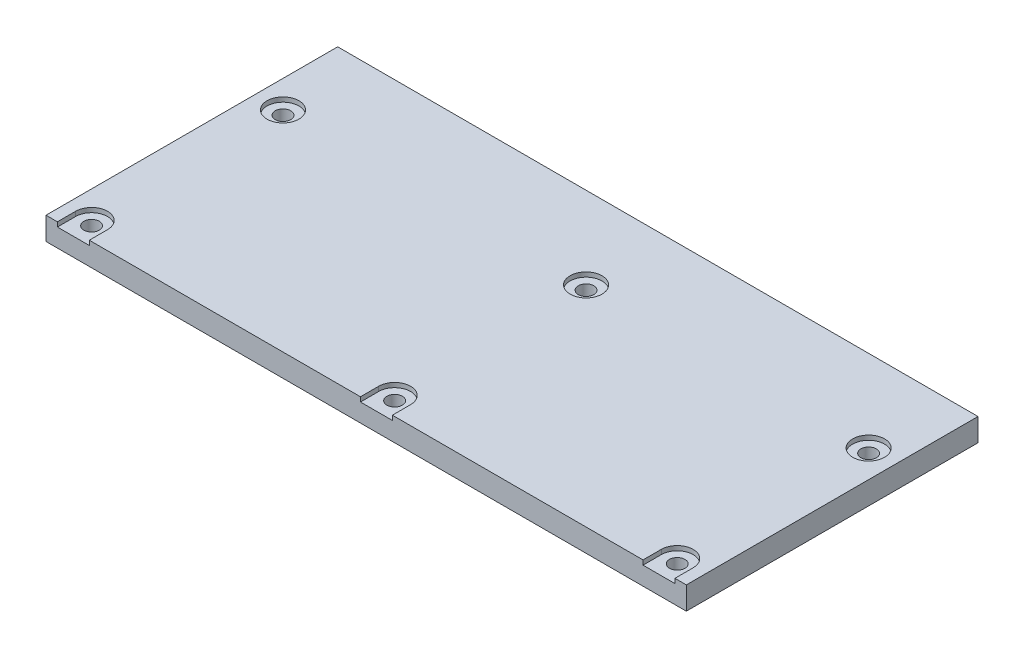
ISO-10303-21;
HEADER;
FILE_DESCRIPTION(('STEP AP214'),'2;1');
FILE_NAME('part.step','',(''),(''),'','','');
FILE_SCHEMA(('AUTOMOTIVE_DESIGN { 1 0 10303 214 1 1 1 1 }'));
ENDSEC;
DATA;
#1=APPLICATION_CONTEXT('core data for automotive mechanical design processes');
#2=APPLICATION_PROTOCOL_DEFINITION('international standard','automotive_design',2000,#1);
#3=PRODUCT_CONTEXT('',#1,'mechanical');
#4=PRODUCT('Part','Part','',(#3));
#5=PRODUCT_RELATED_PRODUCT_CATEGORY('part','',(#4));
#6=PRODUCT_DEFINITION_FORMATION('','',#4);
#7=PRODUCT_DEFINITION_CONTEXT('part definition',#1,'design');
#8=PRODUCT_DEFINITION('design','',#6,#7);
#9=PRODUCT_DEFINITION_SHAPE('','',#8);
#10=(LENGTH_UNIT() NAMED_UNIT(*) SI_UNIT(.MILLI.,.METRE.));
#11=(NAMED_UNIT(*) PLANE_ANGLE_UNIT() SI_UNIT($,.RADIAN.));
#12=(NAMED_UNIT(*) SI_UNIT($,.STERADIAN.) SOLID_ANGLE_UNIT());
#13=UNCERTAINTY_MEASURE_WITH_UNIT(LENGTH_MEASURE(1.E-05),#10,'distance_accuracy_value','');
#14=(GEOMETRIC_REPRESENTATION_CONTEXT(3) GLOBAL_UNCERTAINTY_ASSIGNED_CONTEXT((#13)) GLOBAL_UNIT_ASSIGNED_CONTEXT((#10,
#11,#12)) REPRESENTATION_CONTEXT('',''));
#15=CARTESIAN_POINT('',(0.,0.,0.));
#16=DIRECTION('',(0.,0.,1.));
#17=DIRECTION('',(1.,0.,0.));
#18=AXIS2_PLACEMENT_3D('',#15,#16,#17);
#19=CARTESIAN_POINT('',(-87.2486187845304,5.,-43.8729281767956));
#20=DIRECTION('',(1.,0.,0.));
#21=DIRECTION('',(0.,0.,-1.));
#22=AXIS2_PLACEMENT_3D('',#19,#20,#21);
#23=PLANE('',#22);
#24=DIRECTION('',(0.,0.,1.));
#25=VECTOR('',#24,1.);
#26=CARTESIAN_POINT('',(-87.2486187845304,0.,-43.8729281767956));
#27=LINE('',#26,#25);
#28=CARTESIAN_POINT('',(-87.2486187845304,0.,-43.8729281767956));
#29=VERTEX_POINT('',#28);
#30=CARTESIAN_POINT('',(-87.2486187845304,0.,20.1270718232044));
#31=VERTEX_POINT('',#30);
#32=EDGE_CURVE('E296',#29,#31,#27,.T.);
#33=ORIENTED_EDGE('',*,*,#32,.T.);
#34=DIRECTION('',(0.,-1.,0.));
#35=VECTOR('',#34,1.);
#36=CARTESIAN_POINT('',(-87.2486187845304,5.,20.1270718232044));
#37=LINE('',#36,#35);
#38=CARTESIAN_POINT('',(-87.2486187845304,5.,20.1270718232044));
#39=VERTEX_POINT('',#38);
#40=EDGE_CURVE('E11',#39,#31,#37,.T.);
#41=ORIENTED_EDGE('',*,*,#40,.F.);
#42=DIRECTION('',(0.,0.,1.));
#43=VECTOR('',#42,1.);
#44=CARTESIAN_POINT('',(-87.2486187845304,5.,-43.8729281767956));
#45=LINE('',#44,#43);
#46=CARTESIAN_POINT('',(-87.2486187845304,5.,-43.8729281767956));
#47=VERTEX_POINT('',#46);
#48=EDGE_CURVE('E297',#47,#39,#45,.T.);
#49=ORIENTED_EDGE('',*,*,#48,.F.);
#50=DIRECTION('',(0.,-1.,0.));
#51=VECTOR('',#50,1.);
#52=CARTESIAN_POINT('',(-87.2486187845304,5.,-43.8729281767956));
#53=LINE('',#52,#51);
#54=EDGE_CURVE('E309',#47,#29,#53,.T.);
#55=ORIENTED_EDGE('',*,*,#54,.T.);
#56=EDGE_LOOP('',(#33,#41,#49,#55));
#57=FACE_BOUND('',#56,.T.);
#58=ADVANCED_FACE('F40',(#57),#23,.F.);
#59=CARTESIAN_POINT('',(-87.2486187845304,5.,20.1270718232044));
#60=DIRECTION('',(0.,0.,-1.));
#61=DIRECTION('',(-1.,0.,0.));
#62=AXIS2_PLACEMENT_3D('',#59,#60,#61);
#63=PLANE('',#62);
#64=DIRECTION('',(1.,0.,0.));
#65=VECTOR('',#64,1.);
#66=CARTESIAN_POINT('',(-87.2486187845304,5.,20.1270718232044));
#67=LINE('',#66,#65);
#68=CARTESIAN_POINT('',(-77.7486187845304,5.,20.1270718232044));
#69=VERTEX_POINT('',#68);
#70=CARTESIAN_POINT('',(-18.2486187845304,5.,20.1270718232044));
#71=VERTEX_POINT('',#70);
#72=EDGE_CURVE('E176',#69,#71,#67,.T.);
#73=ORIENTED_EDGE('',*,*,#72,.F.);
#74=DIRECTION('',(0.,1.,0.));
#75=VECTOR('',#74,1.);
#76=CARTESIAN_POINT('',(-77.7486187845304,-4.06225774829856,20.1270718232044));
#77=LINE('',#76,#75);
#78=CARTESIAN_POINT('',(-77.7486187845304,4.,20.1270718232044));
#79=VERTEX_POINT('',#78);
#80=EDGE_CURVE('E155',#79,#69,#77,.T.);
#81=ORIENTED_EDGE('',*,*,#80,.F.);
#82=DIRECTION('',(1.,0.,0.));
#83=VECTOR('',#82,1.);
#84=CARTESIAN_POINT('',(-84.7486187845304,4.,20.1270718232044));
#85=LINE('',#84,#83);
#86=CARTESIAN_POINT('',(-84.7486187845304,4.,20.1270718232044));
#87=VERTEX_POINT('',#86);
#88=EDGE_CURVE('E164',#87,#79,#85,.T.);
#89=ORIENTED_EDGE('',*,*,#88,.F.);
#90=DIRECTION('',(0.,1.,0.));
#91=VECTOR('',#90,1.);
#92=CARTESIAN_POINT('',(-84.7486187845304,-4.06225774829856,20.1270718232044));
#93=LINE('',#92,#91);
#94=CARTESIAN_POINT('',(-84.7486187845304,5.,20.1270718232044));
#95=VERTEX_POINT('',#94);
#96=EDGE_CURVE('E181',#87,#95,#93,.T.);
#97=ORIENTED_EDGE('',*,*,#96,.T.);
#98=EDGE_CURVE('E302',#39,#95,#67,.T.);
#99=ORIENTED_EDGE('',*,*,#98,.F.);
#100=ORIENTED_EDGE('',*,*,#40,.T.);
#101=DIRECTION('',(1.,0.,0.));
#102=VECTOR('',#101,1.);
#103=CARTESIAN_POINT('',(-87.2486187845304,0.,20.1270718232044));
#104=LINE('',#103,#102);
#105=CARTESIAN_POINT('',(53.2513812154696,0.,20.1270718232044));
#106=VERTEX_POINT('',#105);
#107=EDGE_CURVE('E312',#31,#106,#104,.T.);
#108=ORIENTED_EDGE('',*,*,#107,.T.);
#109=DIRECTION('',(0.,-1.,0.));
#110=VECTOR('',#109,1.);
#111=CARTESIAN_POINT('',(53.2513812154696,5.,20.1270718232044));
#112=LINE('',#111,#110);
#113=CARTESIAN_POINT('',(53.2513812154696,5.,20.1270718232044));
#114=VERTEX_POINT('',#113);
#115=EDGE_CURVE('E47',#114,#106,#112,.T.);
#116=ORIENTED_EDGE('',*,*,#115,.F.);
#117=CARTESIAN_POINT('',(50.7513812154696,5.,20.1270718232044));
#118=VERTEX_POINT('',#117);
#119=EDGE_CURVE('E300',#118,#114,#67,.T.);
#120=ORIENTED_EDGE('',*,*,#119,.F.);
#121=DIRECTION('',(0.,1.,0.));
#122=VECTOR('',#121,1.);
#123=CARTESIAN_POINT('',(50.7513812154696,-4.06225774829856,20.1270718232044));
#124=LINE('',#123,#122);
#125=CARTESIAN_POINT('',(50.7513812154696,4.,20.1270718232044));
#126=VERTEX_POINT('',#125);
#127=EDGE_CURVE('E209',#126,#118,#124,.T.);
#128=ORIENTED_EDGE('',*,*,#127,.F.);
#129=DIRECTION('',(1.,0.,0.));
#130=VECTOR('',#129,1.);
#131=CARTESIAN_POINT('',(43.7513812154696,4.,20.1270718232044));
#132=LINE('',#131,#130);
#133=CARTESIAN_POINT('',(43.7513812154696,4.,20.1270718232044));
#134=VERTEX_POINT('',#133);
#135=EDGE_CURVE('E211',#134,#126,#132,.T.);
#136=ORIENTED_EDGE('',*,*,#135,.F.);
#137=DIRECTION('',(0.,1.,0.));
#138=VECTOR('',#137,1.);
#139=CARTESIAN_POINT('',(43.7513812154696,-4.06225774829856,20.1270718232044));
#140=LINE('',#139,#138);
#141=CARTESIAN_POINT('',(43.7513812154696,5.,20.1270718232044));
#142=VERTEX_POINT('',#141);
#143=EDGE_CURVE('E206',#134,#142,#140,.T.);
#144=ORIENTED_EDGE('',*,*,#143,.T.);
#145=CARTESIAN_POINT('',(-11.2486187845304,5.,20.1270718232044));
#146=VERTEX_POINT('',#145);
#147=EDGE_CURVE('E347',#146,#142,#67,.T.);
#148=ORIENTED_EDGE('',*,*,#147,.F.);
#149=DIRECTION('',(0.,1.,0.));
#150=VECTOR('',#149,1.);
#151=CARTESIAN_POINT('',(-11.2486187845304,-4.06225774829856,20.1270718232044));
#152=LINE('',#151,#150);
#153=CARTESIAN_POINT('',(-11.2486187845304,4.,20.1270718232044));
#154=VERTEX_POINT('',#153);
#155=EDGE_CURVE('E187',#154,#146,#152,.T.);
#156=ORIENTED_EDGE('',*,*,#155,.F.);
#157=DIRECTION('',(1.,0.,0.));
#158=VECTOR('',#157,1.);
#159=CARTESIAN_POINT('',(-18.2486187845304,4.,20.1270718232044));
#160=LINE('',#159,#158);
#161=CARTESIAN_POINT('',(-18.2486187845304,4.,20.1270718232044));
#162=VERTEX_POINT('',#161);
#163=EDGE_CURVE('E189',#162,#154,#160,.T.);
#164=ORIENTED_EDGE('',*,*,#163,.F.);
#165=DIRECTION('',(0.,1.,0.));
#166=VECTOR('',#165,1.);
#167=CARTESIAN_POINT('',(-18.2486187845304,-4.06225774829856,20.1270718232044));
#168=LINE('',#167,#166);
#169=EDGE_CURVE('E184',#162,#71,#168,.T.);
#170=ORIENTED_EDGE('',*,*,#169,.T.);
#171=EDGE_LOOP('',(#73,#81,#89,#97,#99,#100,#108,#116,#120,#128,#136,#144,#148,#156,#164,#170));
#172=FACE_BOUND('',#171,.T.);
#173=ADVANCED_FACE('F173',(#172),#63,.F.);
#174=CARTESIAN_POINT('',(53.2513812154696,5.,-43.8729281767956));
#175=DIRECTION('',(-1.,0.,0.));
#176=DIRECTION('',(0.,0.,1.));
#177=AXIS2_PLACEMENT_3D('',#174,#175,#176);
#178=PLANE('',#177);
#179=DIRECTION('',(0.,0.,-1.));
#180=VECTOR('',#179,1.);
#181=CARTESIAN_POINT('',(53.2513812154696,0.,-43.8729281767956));
#182=LINE('',#181,#180);
#183=CARTESIAN_POINT('',(53.2513812154696,0.,-43.8729281767956));
#184=VERTEX_POINT('',#183);
#185=EDGE_CURVE('E314',#106,#184,#182,.T.);
#186=ORIENTED_EDGE('',*,*,#185,.T.);
#187=DIRECTION('',(0.,-1.,0.));
#188=VECTOR('',#187,1.);
#189=CARTESIAN_POINT('',(53.2513812154696,5.,-43.8729281767956));
#190=LINE('',#189,#188);
#191=CARTESIAN_POINT('',(53.2513812154696,5.,-43.8729281767956));
#192=VERTEX_POINT('',#191);
#193=EDGE_CURVE('E319',#192,#184,#190,.T.);
#194=ORIENTED_EDGE('',*,*,#193,.F.);
#195=DIRECTION('',(0.,0.,-1.));
#196=VECTOR('',#195,1.);
#197=CARTESIAN_POINT('',(53.2513812154696,5.,-43.8729281767956));
#198=LINE('',#197,#196);
#199=EDGE_CURVE('E305',#114,#192,#198,.T.);
#200=ORIENTED_EDGE('',*,*,#199,.F.);
#201=ORIENTED_EDGE('',*,*,#115,.T.);
#202=EDGE_LOOP('',(#186,#194,#200,#201));
#203=FACE_BOUND('',#202,.T.);
#204=ADVANCED_FACE('F326',(#203),#178,.F.);
#205=CARTESIAN_POINT('',(-87.2486187845304,5.,-43.8729281767956));
#206=DIRECTION('',(0.,0.,1.));
#207=DIRECTION('',(1.,0.,0.));
#208=AXIS2_PLACEMENT_3D('',#205,#206,#207);
#209=PLANE('',#208);
#210=DIRECTION('',(-1.,0.,0.));
#211=VECTOR('',#210,1.);
#212=CARTESIAN_POINT('',(-87.2486187845304,0.,-43.8729281767956));
#213=LINE('',#212,#211);
#214=EDGE_CURVE('E301',#184,#29,#213,.T.);
#215=ORIENTED_EDGE('',*,*,#214,.T.);
#216=ORIENTED_EDGE('',*,*,#54,.F.);
#217=DIRECTION('',(-1.,0.,0.));
#218=VECTOR('',#217,1.);
#219=CARTESIAN_POINT('',(-87.2486187845304,5.,-43.8729281767956));
#220=LINE('',#219,#218);
#221=EDGE_CURVE('E307',#192,#47,#220,.T.);
#222=ORIENTED_EDGE('',*,*,#221,.F.);
#223=ORIENTED_EDGE('',*,*,#193,.T.);
#224=EDGE_LOOP('',(#215,#216,#222,#223));
#225=FACE_BOUND('',#224,.T.);
#226=ADVANCED_FACE('F335',(#225),#209,.F.);
#227=CARTESIAN_POINT('',(0.,5.,0.));
#228=DIRECTION('',(0.,1.,0.));
#229=DIRECTION('',(0.,0.,1.));
#230=AXIS2_PLACEMENT_3D('',#227,#228,#229);
#231=PLANE('',#230);
#232=DIRECTION('',(0.,0.,-1.));
#233=VECTOR('',#232,1.);
#234=CARTESIAN_POINT('',(-77.7486187845304,5.,16.1270718232044));
#235=LINE('',#234,#233);
#236=CARTESIAN_POINT('',(-77.7486187845304,5.,16.1270718232044));
#237=VERTEX_POINT('',#236);
#238=EDGE_CURVE('E170',#69,#237,#235,.T.);
#239=ORIENTED_EDGE('',*,*,#238,.F.);
#240=ORIENTED_EDGE('',*,*,#72,.T.);
#241=DIRECTION('',(0.,0.,1.));
#242=VECTOR('',#241,1.);
#243=CARTESIAN_POINT('',(-18.2486187845304,5.,16.1270718232044));
#244=LINE('',#243,#242);
#245=CARTESIAN_POINT('',(-18.2486187845304,5.,16.1270718232044));
#246=VERTEX_POINT('',#245);
#247=EDGE_CURVE('E202',#246,#71,#244,.T.);
#248=ORIENTED_EDGE('',*,*,#247,.F.);
#249=CARTESIAN_POINT('',(-14.7486187845304,5.,16.1270718232044));
#250=DIRECTION('',(0.,1.,0.));
#251=DIRECTION('',(0.,0.,1.));
#252=AXIS2_PLACEMENT_3D('',#249,#250,#251);
#253=CIRCLE('',#252,3.5);
#254=CARTESIAN_POINT('',(-11.2486187845304,5.,16.1270718232044));
#255=VERTEX_POINT('',#254);
#256=EDGE_CURVE('E260',#255,#246,#253,.T.);
#257=ORIENTED_EDGE('',*,*,#256,.F.);
#258=DIRECTION('',(0.,0.,-1.));
#259=VECTOR('',#258,1.);
#260=CARTESIAN_POINT('',(-11.2486187845304,5.,16.1270718232044));
#261=LINE('',#260,#259);
#262=EDGE_CURVE('E201',#146,#255,#261,.T.);
#263=ORIENTED_EDGE('',*,*,#262,.F.);
#264=ORIENTED_EDGE('',*,*,#147,.T.);
#265=DIRECTION('',(0.,0.,1.));
#266=VECTOR('',#265,1.);
#267=CARTESIAN_POINT('',(43.7513812154696,5.,16.1270718232044));
#268=LINE('',#267,#266);
#269=CARTESIAN_POINT('',(43.7513812154696,5.,16.1270718232044));
#270=VERTEX_POINT('',#269);
#271=EDGE_CURVE('E186',#270,#142,#268,.T.);
#272=ORIENTED_EDGE('',*,*,#271,.F.);
#273=CARTESIAN_POINT('',(47.2513812154696,5.,16.1270718232044));
#274=DIRECTION('',(0.,1.,0.));
#275=DIRECTION('',(0.,0.,1.));
#276=AXIS2_PLACEMENT_3D('',#273,#274,#275);
#277=CIRCLE('',#276,3.5);
#278=CARTESIAN_POINT('',(50.7513812154696,5.,16.1270718232044));
#279=VERTEX_POINT('',#278);
#280=EDGE_CURVE('E284',#279,#270,#277,.T.);
#281=ORIENTED_EDGE('',*,*,#280,.F.);
#282=DIRECTION('',(0.,0.,-1.));
#283=VECTOR('',#282,1.);
#284=CARTESIAN_POINT('',(50.7513812154696,5.,16.1270718232044));
#285=LINE('',#284,#283);
#286=EDGE_CURVE('E223',#118,#279,#285,.T.);
#287=ORIENTED_EDGE('',*,*,#286,.F.);
#288=ORIENTED_EDGE('',*,*,#119,.T.);
#289=ORIENTED_EDGE('',*,*,#199,.T.);
#290=ORIENTED_EDGE('',*,*,#221,.T.);
#291=ORIENTED_EDGE('',*,*,#48,.T.);
#292=ORIENTED_EDGE('',*,*,#98,.T.);
#293=DIRECTION('',(0.,0.,1.));
#294=VECTOR('',#293,1.);
#295=CARTESIAN_POINT('',(-84.7486187845304,5.,16.1270718232044));
#296=LINE('',#295,#294);
#297=CARTESIAN_POINT('',(-84.7486187845304,5.,16.1270718232044));
#298=VERTEX_POINT('',#297);
#299=EDGE_CURVE('E204',#298,#95,#296,.T.);
#300=ORIENTED_EDGE('',*,*,#299,.F.);
#301=CARTESIAN_POINT('',(-81.2486187845304,5.,16.1270718232044));
#302=DIRECTION('',(0.,1.,0.));
#303=DIRECTION('',(0.,0.,1.));
#304=AXIS2_PLACEMENT_3D('',#301,#302,#303);
#305=CIRCLE('',#304,3.5);
#306=EDGE_CURVE('E237',#237,#298,#305,.T.);
#307=ORIENTED_EDGE('',*,*,#306,.F.);
#308=EDGE_LOOP('',(#239,#240,#248,#257,#263,#264,#272,#281,#287,#288,#289,#290,#291,#292,#300,#307));
#309=FACE_BOUND('',#308,.T.);
#310=CARTESIAN_POINT('',(-81.2486187845304,5.,-25.8729281767956));
#311=DIRECTION('',(0.,1.,0.));
#312=DIRECTION('',(0.,0.,1.));
#313=AXIS2_PLACEMENT_3D('',#310,#311,#312);
#314=CIRCLE('',#313,3.5);
#315=CARTESIAN_POINT('',(-81.2486187845304,5.,-22.3729281767956));
#316=VERTEX_POINT('',#315);
#317=EDGE_CURVE('E183',#316,#316,#314,.T.);
#318=ORIENTED_EDGE('',*,*,#317,.F.);
#319=EDGE_LOOP('',(#318));
#320=FACE_BOUND('',#319,.T.);
#321=CARTESIAN_POINT('',(-14.7486187845304,5.,-25.8729281767956));
#322=DIRECTION('',(0.,1.,0.));
#323=DIRECTION('',(0.,0.,1.));
#324=AXIS2_PLACEMENT_3D('',#321,#322,#323);
#325=CIRCLE('',#324,3.5);
#326=CARTESIAN_POINT('',(-14.7486187845304,5.,-22.3729281767956));
#327=VERTEX_POINT('',#326);
#328=EDGE_CURVE('E248',#327,#327,#325,.T.);
#329=ORIENTED_EDGE('',*,*,#328,.F.);
#330=EDGE_LOOP('',(#329));
#331=FACE_BOUND('',#330,.T.);
#332=CARTESIAN_POINT('',(47.2513812154696,5.,-25.8729281767956));
#333=DIRECTION('',(0.,1.,0.));
#334=DIRECTION('',(0.,0.,1.));
#335=AXIS2_PLACEMENT_3D('',#332,#333,#334);
#336=CIRCLE('',#335,3.5);
#337=CARTESIAN_POINT('',(47.2513812154696,5.,-22.3729281767956));
#338=VERTEX_POINT('',#337);
#339=EDGE_CURVE('E272',#338,#338,#336,.T.);
#340=ORIENTED_EDGE('',*,*,#339,.F.);
#341=EDGE_LOOP('',(#340));
#342=FACE_BOUND('',#341,.T.);
#343=ADVANCED_FACE('F341',(#309,#320,#331,#342),#231,.T.);
#344=CARTESIAN_POINT('',(0.,0.,0.));
#345=DIRECTION('',(0.,1.,0.));
#346=DIRECTION('',(0.,0.,1.));
#347=AXIS2_PLACEMENT_3D('',#344,#345,#346);
#348=PLANE('',#347);
#349=CARTESIAN_POINT('',(-81.2486187845304,0.,-25.8729281767956));
#350=DIRECTION('',(0.,1.,0.));
#351=DIRECTION('',(0.,0.,1.));
#352=AXIS2_PLACEMENT_3D('',#349,#350,#351);
#353=CIRCLE('',#352,1.69999999999999);
#354=CARTESIAN_POINT('',(-81.2486187845304,0.,-24.1729281767956));
#355=VERTEX_POINT('',#354);
#356=EDGE_CURVE('E234',#355,#355,#353,.T.);
#357=ORIENTED_EDGE('',*,*,#356,.T.);
#358=EDGE_LOOP('',(#357));
#359=FACE_BOUND('',#358,.T.);
#360=CARTESIAN_POINT('',(-81.2486187845304,0.,16.1270718232044));
#361=DIRECTION('',(0.,1.,0.));
#362=DIRECTION('',(0.,0.,1.));
#363=AXIS2_PLACEMENT_3D('',#360,#361,#362);
#364=CIRCLE('',#363,1.69999999999999);
#365=CARTESIAN_POINT('',(-81.2486187845304,0.,17.8270718232044));
#366=VERTEX_POINT('',#365);
#367=EDGE_CURVE('E245',#366,#366,#364,.T.);
#368=ORIENTED_EDGE('',*,*,#367,.T.);
#369=EDGE_LOOP('',(#368));
#370=FACE_BOUND('',#369,.T.);
#371=CARTESIAN_POINT('',(-14.7486187845304,0.,-25.8729281767956));
#372=DIRECTION('',(0.,1.,0.));
#373=DIRECTION('',(0.,0.,1.));
#374=AXIS2_PLACEMENT_3D('',#371,#372,#373);
#375=CIRCLE('',#374,1.7);
#376=CARTESIAN_POINT('',(-14.7486187845304,0.,-24.1729281767956));
#377=VERTEX_POINT('',#376);
#378=EDGE_CURVE('E257',#377,#377,#375,.T.);
#379=ORIENTED_EDGE('',*,*,#378,.T.);
#380=EDGE_LOOP('',(#379));
#381=FACE_BOUND('',#380,.T.);
#382=CARTESIAN_POINT('',(-14.7486187845304,0.,16.1270718232044));
#383=DIRECTION('',(0.,1.,0.));
#384=DIRECTION('',(0.,0.,1.));
#385=AXIS2_PLACEMENT_3D('',#382,#383,#384);
#386=CIRCLE('',#385,1.7);
#387=CARTESIAN_POINT('',(-14.7486187845304,0.,17.8270718232044));
#388=VERTEX_POINT('',#387);
#389=EDGE_CURVE('E269',#388,#388,#386,.T.);
#390=ORIENTED_EDGE('',*,*,#389,.T.);
#391=EDGE_LOOP('',(#390));
#392=FACE_BOUND('',#391,.T.);
#393=CARTESIAN_POINT('',(47.2513812154696,0.,-25.8729281767956));
#394=DIRECTION('',(0.,1.,0.));
#395=DIRECTION('',(0.,0.,1.));
#396=AXIS2_PLACEMENT_3D('',#393,#394,#395);
#397=CIRCLE('',#396,1.7);
#398=CARTESIAN_POINT('',(47.2513812154696,0.,-24.1729281767956));
#399=VERTEX_POINT('',#398);
#400=EDGE_CURVE('E281',#399,#399,#397,.T.);
#401=ORIENTED_EDGE('',*,*,#400,.T.);
#402=EDGE_LOOP('',(#401));
#403=FACE_BOUND('',#402,.T.);
#404=CARTESIAN_POINT('',(47.2513812154696,0.,16.1270718232044));
#405=DIRECTION('',(0.,1.,0.));
#406=DIRECTION('',(0.,0.,1.));
#407=AXIS2_PLACEMENT_3D('',#404,#405,#406);
#408=CIRCLE('',#407,1.7);
#409=CARTESIAN_POINT('',(47.2513812154696,0.,17.8270718232044));
#410=VERTEX_POINT('',#409);
#411=EDGE_CURVE('E293',#410,#410,#408,.T.);
#412=ORIENTED_EDGE('',*,*,#411,.T.);
#413=EDGE_LOOP('',(#412));
#414=FACE_BOUND('',#413,.T.);
#415=ORIENTED_EDGE('',*,*,#32,.F.);
#416=ORIENTED_EDGE('',*,*,#214,.F.);
#417=ORIENTED_EDGE('',*,*,#185,.F.);
#418=ORIENTED_EDGE('',*,*,#107,.F.);
#419=EDGE_LOOP('',(#415,#416,#417,#418));
#420=FACE_BOUND('',#419,.T.);
#421=ADVANCED_FACE('F332',(#359,#370,#381,#392,#403,#414,#420),#348,.F.);
#422=CARTESIAN_POINT('',(47.2513812154696,5.,16.1270718232044));
#423=DIRECTION('',(0.,1.,0.));
#424=DIRECTION('',(0.,0.,1.));
#425=AXIS2_PLACEMENT_3D('',#422,#423,#424);
#426=CYLINDRICAL_SURFACE('',#425,1.7);
#427=ORIENTED_EDGE('',*,*,#411,.F.);
#428=EDGE_LOOP('',(#427));
#429=FACE_BOUND('',#428,.T.);
#430=CARTESIAN_POINT('',(47.2513812154696,4.,16.1270718232044));
#431=DIRECTION('',(0.,1.,0.));
#432=DIRECTION('',(0.,0.,1.));
#433=AXIS2_PLACEMENT_3D('',#430,#431,#432);
#434=CIRCLE('',#433,1.7);
#435=CARTESIAN_POINT('',(47.2513812154696,4.,17.8270718232044));
#436=VERTEX_POINT('',#435);
#437=EDGE_CURVE('E290',#436,#436,#434,.T.);
#438=ORIENTED_EDGE('',*,*,#437,.T.);
#439=EDGE_LOOP('',(#438));
#440=FACE_BOUND('',#439,.T.);
#441=ADVANCED_FACE('F392',(#429,#440),#426,.F.);
#442=CARTESIAN_POINT('',(48.9513812154696,4.,16.1270718232044));
#443=DIRECTION('',(0.,-1.,0.));
#444=DIRECTION('',(0.,0.,-1.));
#445=AXIS2_PLACEMENT_3D('',#442,#443,#444);
#446=PLANE('',#445);
#447=ORIENTED_EDGE('',*,*,#437,.F.);
#448=EDGE_LOOP('',(#447));
#449=FACE_BOUND('',#448,.T.);
#450=CARTESIAN_POINT('',(47.2513812154696,4.,16.1270718232044));
#451=DIRECTION('',(0.,1.,0.));
#452=DIRECTION('',(0.,0.,1.));
#453=AXIS2_PLACEMENT_3D('',#450,#451,#452);
#454=CIRCLE('',#453,3.5);
#455=CARTESIAN_POINT('',(50.7513812154696,4.,16.1270718232044));
#456=VERTEX_POINT('',#455);
#457=CARTESIAN_POINT('',(43.7513812154696,4.,16.1270718232044));
#458=VERTEX_POINT('',#457);
#459=EDGE_CURVE('E287',#456,#458,#454,.T.);
#460=ORIENTED_EDGE('',*,*,#459,.T.);
#461=DIRECTION('',(0.,0.,1.));
#462=VECTOR('',#461,1.);
#463=CARTESIAN_POINT('',(43.7513812154696,4.,16.1270718232044));
#464=LINE('',#463,#462);
#465=EDGE_CURVE('E54',#458,#134,#464,.T.);
#466=ORIENTED_EDGE('',*,*,#465,.T.);
#467=ORIENTED_EDGE('',*,*,#135,.T.);
#468=DIRECTION('',(0.,0.,-1.));
#469=VECTOR('',#468,1.);
#470=CARTESIAN_POINT('',(50.7513812154696,4.,16.1270718232044));
#471=LINE('',#470,#469);
#472=EDGE_CURVE('E212',#126,#456,#471,.T.);
#473=ORIENTED_EDGE('',*,*,#472,.T.);
#474=EDGE_LOOP('',(#460,#466,#467,#473));
#475=FACE_BOUND('',#474,.T.);
#476=ADVANCED_FACE('F397',(#449,#475),#446,.F.);
#477=CARTESIAN_POINT('',(47.2513812154696,5.,16.1270718232044));
#478=DIRECTION('',(0.,1.,0.));
#479=DIRECTION('',(0.,0.,1.));
#480=AXIS2_PLACEMENT_3D('',#477,#478,#479);
#481=CYLINDRICAL_SURFACE('',#480,3.5);
#482=ORIENTED_EDGE('',*,*,#459,.F.);
#483=DIRECTION('',(0.,1.,0.));
#484=VECTOR('',#483,1.);
#485=CARTESIAN_POINT('',(50.7513812154696,-4.06225774829856,16.1270718232044));
#486=LINE('',#485,#484);
#487=EDGE_CURVE('E213',#456,#279,#486,.T.);
#488=ORIENTED_EDGE('',*,*,#487,.T.);
#489=ORIENTED_EDGE('',*,*,#280,.T.);
#490=DIRECTION('',(0.,1.,0.));
#491=VECTOR('',#490,1.);
#492=CARTESIAN_POINT('',(43.7513812154696,-4.06225774829856,16.1270718232044));
#493=LINE('',#492,#491);
#494=EDGE_CURVE('E216',#458,#270,#493,.T.);
#495=ORIENTED_EDGE('',*,*,#494,.F.);
#496=EDGE_LOOP('',(#482,#488,#489,#495));
#497=FACE_BOUND('',#496,.T.);
#498=ADVANCED_FACE('F401',(#497),#481,.F.);
#499=CARTESIAN_POINT('',(47.2513812154696,5.,-25.8729281767956));
#500=DIRECTION('',(0.,1.,0.));
#501=DIRECTION('',(0.,0.,1.));
#502=AXIS2_PLACEMENT_3D('',#499,#500,#501);
#503=CYLINDRICAL_SURFACE('',#502,1.7);
#504=ORIENTED_EDGE('',*,*,#400,.F.);
#505=EDGE_LOOP('',(#504));
#506=FACE_BOUND('',#505,.T.);
#507=CARTESIAN_POINT('',(47.2513812154696,4.,-25.8729281767956));
#508=DIRECTION('',(0.,1.,0.));
#509=DIRECTION('',(0.,0.,1.));
#510=AXIS2_PLACEMENT_3D('',#507,#508,#509);
#511=CIRCLE('',#510,1.7);
#512=CARTESIAN_POINT('',(47.2513812154696,4.,-24.1729281767956));
#513=VERTEX_POINT('',#512);
#514=EDGE_CURVE('E278',#513,#513,#511,.T.);
#515=ORIENTED_EDGE('',*,*,#514,.T.);
#516=EDGE_LOOP('',(#515));
#517=FACE_BOUND('',#516,.T.);
#518=ADVANCED_FACE('F405',(#506,#517),#503,.F.);
#519=CARTESIAN_POINT('',(48.9513812154696,4.,-25.8729281767956));
#520=DIRECTION('',(0.,-1.,0.));
#521=DIRECTION('',(0.,0.,-1.));
#522=AXIS2_PLACEMENT_3D('',#519,#520,#521);
#523=PLANE('',#522);
#524=ORIENTED_EDGE('',*,*,#514,.F.);
#525=EDGE_LOOP('',(#524));
#526=FACE_BOUND('',#525,.T.);
#527=CARTESIAN_POINT('',(47.2513812154696,4.,-25.8729281767956));
#528=DIRECTION('',(0.,1.,0.));
#529=DIRECTION('',(0.,0.,1.));
#530=AXIS2_PLACEMENT_3D('',#527,#528,#529);
#531=CIRCLE('',#530,3.5);
#532=CARTESIAN_POINT('',(47.2513812154696,4.,-22.3729281767956));
#533=VERTEX_POINT('',#532);
#534=EDGE_CURVE('E275',#533,#533,#531,.T.);
#535=ORIENTED_EDGE('',*,*,#534,.T.);
#536=EDGE_LOOP('',(#535));
#537=FACE_BOUND('',#536,.T.);
#538=ADVANCED_FACE('F409',(#526,#537),#523,.F.);
#539=CARTESIAN_POINT('',(47.2513812154696,5.,-25.8729281767956));
#540=DIRECTION('',(0.,1.,0.));
#541=DIRECTION('',(0.,0.,1.));
#542=AXIS2_PLACEMENT_3D('',#539,#540,#541);
#543=CYLINDRICAL_SURFACE('',#542,3.5);
#544=ORIENTED_EDGE('',*,*,#534,.F.);
#545=EDGE_LOOP('',(#544));
#546=FACE_BOUND('',#545,.T.);
#547=ORIENTED_EDGE('',*,*,#339,.T.);
#548=EDGE_LOOP('',(#547));
#549=FACE_BOUND('',#548,.T.);
#550=ADVANCED_FACE('F413',(#546,#549),#543,.F.);
#551=CARTESIAN_POINT('',(-14.7486187845304,5.,16.1270718232044));
#552=DIRECTION('',(0.,1.,0.));
#553=DIRECTION('',(0.,0.,1.));
#554=AXIS2_PLACEMENT_3D('',#551,#552,#553);
#555=CYLINDRICAL_SURFACE('',#554,1.7);
#556=ORIENTED_EDGE('',*,*,#389,.F.);
#557=EDGE_LOOP('',(#556));
#558=FACE_BOUND('',#557,.T.);
#559=CARTESIAN_POINT('',(-14.7486187845304,4.,16.1270718232044));
#560=DIRECTION('',(0.,1.,0.));
#561=DIRECTION('',(0.,0.,1.));
#562=AXIS2_PLACEMENT_3D('',#559,#560,#561);
#563=CIRCLE('',#562,1.7);
#564=CARTESIAN_POINT('',(-14.7486187845304,4.,17.8270718232044));
#565=VERTEX_POINT('',#564);
#566=EDGE_CURVE('E266',#565,#565,#563,.T.);
#567=ORIENTED_EDGE('',*,*,#566,.T.);
#568=EDGE_LOOP('',(#567));
#569=FACE_BOUND('',#568,.T.);
#570=ADVANCED_FACE('F417',(#558,#569),#555,.F.);
#571=CARTESIAN_POINT('',(-13.0486187845304,4.,16.1270718232044));
#572=DIRECTION('',(0.,-1.,0.));
#573=DIRECTION('',(0.,0.,-1.));
#574=AXIS2_PLACEMENT_3D('',#571,#572,#573);
#575=PLANE('',#574);
#576=ORIENTED_EDGE('',*,*,#566,.F.);
#577=EDGE_LOOP('',(#576));
#578=FACE_BOUND('',#577,.T.);
#579=CARTESIAN_POINT('',(-14.7486187845304,4.,16.1270718232044));
#580=DIRECTION('',(0.,1.,0.));
#581=DIRECTION('',(0.,0.,1.));
#582=AXIS2_PLACEMENT_3D('',#579,#580,#581);
#583=CIRCLE('',#582,3.5);
#584=CARTESIAN_POINT('',(-11.2486187845304,4.,16.1270718232044));
#585=VERTEX_POINT('',#584);
#586=CARTESIAN_POINT('',(-18.2486187845304,4.,16.1270718232044));
#587=VERTEX_POINT('',#586);
#588=EDGE_CURVE('E263',#585,#587,#583,.T.);
#589=ORIENTED_EDGE('',*,*,#588,.T.);
#590=DIRECTION('',(0.,0.,1.));
#591=VECTOR('',#590,1.);
#592=CARTESIAN_POINT('',(-18.2486187845304,4.,16.1270718232044));
#593=LINE('',#592,#591);
#594=EDGE_CURVE('E62',#587,#162,#593,.T.);
#595=ORIENTED_EDGE('',*,*,#594,.T.);
#596=ORIENTED_EDGE('',*,*,#163,.T.);
#597=DIRECTION('',(0.,0.,-1.));
#598=VECTOR('',#597,1.);
#599=CARTESIAN_POINT('',(-11.2486187845304,4.,16.1270718232044));
#600=LINE('',#599,#598);
#601=EDGE_CURVE('E190',#154,#585,#600,.T.);
#602=ORIENTED_EDGE('',*,*,#601,.T.);
#603=EDGE_LOOP('',(#589,#595,#596,#602));
#604=FACE_BOUND('',#603,.T.);
#605=ADVANCED_FACE('F421',(#578,#604),#575,.F.);
#606=CARTESIAN_POINT('',(-14.7486187845304,5.,16.1270718232044));
#607=DIRECTION('',(0.,1.,0.));
#608=DIRECTION('',(0.,0.,1.));
#609=AXIS2_PLACEMENT_3D('',#606,#607,#608);
#610=CYLINDRICAL_SURFACE('',#609,3.5);
#611=ORIENTED_EDGE('',*,*,#588,.F.);
#612=DIRECTION('',(0.,1.,0.));
#613=VECTOR('',#612,1.);
#614=CARTESIAN_POINT('',(-11.2486187845304,-4.06225774829856,16.1270718232044));
#615=LINE('',#614,#613);
#616=EDGE_CURVE('E191',#585,#255,#615,.T.);
#617=ORIENTED_EDGE('',*,*,#616,.T.);
#618=ORIENTED_EDGE('',*,*,#256,.T.);
#619=DIRECTION('',(0.,1.,0.));
#620=VECTOR('',#619,1.);
#621=CARTESIAN_POINT('',(-18.2486187845304,-4.06225774829856,16.1270718232044));
#622=LINE('',#621,#620);
#623=EDGE_CURVE('E194',#587,#246,#622,.T.);
#624=ORIENTED_EDGE('',*,*,#623,.F.);
#625=EDGE_LOOP('',(#611,#617,#618,#624));
#626=FACE_BOUND('',#625,.T.);
#627=ADVANCED_FACE('F425',(#626),#610,.F.);
#628=CARTESIAN_POINT('',(-14.7486187845304,5.,-25.8729281767956));
#629=DIRECTION('',(0.,1.,0.));
#630=DIRECTION('',(0.,0.,1.));
#631=AXIS2_PLACEMENT_3D('',#628,#629,#630);
#632=CYLINDRICAL_SURFACE('',#631,1.7);
#633=ORIENTED_EDGE('',*,*,#378,.F.);
#634=EDGE_LOOP('',(#633));
#635=FACE_BOUND('',#634,.T.);
#636=CARTESIAN_POINT('',(-14.7486187845304,4.,-25.8729281767956));
#637=DIRECTION('',(0.,1.,0.));
#638=DIRECTION('',(0.,0.,1.));
#639=AXIS2_PLACEMENT_3D('',#636,#637,#638);
#640=CIRCLE('',#639,1.7);
#641=CARTESIAN_POINT('',(-14.7486187845304,4.,-24.1729281767956));
#642=VERTEX_POINT('',#641);
#643=EDGE_CURVE('E254',#642,#642,#640,.T.);
#644=ORIENTED_EDGE('',*,*,#643,.T.);
#645=EDGE_LOOP('',(#644));
#646=FACE_BOUND('',#645,.T.);
#647=ADVANCED_FACE('F429',(#635,#646),#632,.F.);
#648=CARTESIAN_POINT('',(-13.0486187845304,4.,-25.8729281767956));
#649=DIRECTION('',(0.,-1.,0.));
#650=DIRECTION('',(0.,0.,-1.));
#651=AXIS2_PLACEMENT_3D('',#648,#649,#650);
#652=PLANE('',#651);
#653=ORIENTED_EDGE('',*,*,#643,.F.);
#654=EDGE_LOOP('',(#653));
#655=FACE_BOUND('',#654,.T.);
#656=CARTESIAN_POINT('',(-14.7486187845304,4.,-25.8729281767956));
#657=DIRECTION('',(0.,1.,0.));
#658=DIRECTION('',(0.,0.,1.));
#659=AXIS2_PLACEMENT_3D('',#656,#657,#658);
#660=CIRCLE('',#659,3.5);
#661=CARTESIAN_POINT('',(-14.7486187845304,4.,-22.3729281767956));
#662=VERTEX_POINT('',#661);
#663=EDGE_CURVE('E251',#662,#662,#660,.T.);
#664=ORIENTED_EDGE('',*,*,#663,.T.);
#665=EDGE_LOOP('',(#664));
#666=FACE_BOUND('',#665,.T.);
#667=ADVANCED_FACE('F433',(#655,#666),#652,.F.);
#668=CARTESIAN_POINT('',(-14.7486187845304,5.,-25.8729281767956));
#669=DIRECTION('',(0.,1.,0.));
#670=DIRECTION('',(0.,0.,1.));
#671=AXIS2_PLACEMENT_3D('',#668,#669,#670);
#672=CYLINDRICAL_SURFACE('',#671,3.5);
#673=ORIENTED_EDGE('',*,*,#663,.F.);
#674=EDGE_LOOP('',(#673));
#675=FACE_BOUND('',#674,.T.);
#676=ORIENTED_EDGE('',*,*,#328,.T.);
#677=EDGE_LOOP('',(#676));
#678=FACE_BOUND('',#677,.T.);
#679=ADVANCED_FACE('F437',(#675,#678),#672,.F.);
#680=CARTESIAN_POINT('',(-81.2486187845304,5.,16.1270718232044));
#681=DIRECTION('',(0.,1.,0.));
#682=DIRECTION('',(0.,0.,1.));
#683=AXIS2_PLACEMENT_3D('',#680,#681,#682);
#684=CYLINDRICAL_SURFACE('',#683,1.7);
#685=ORIENTED_EDGE('',*,*,#367,.F.);
#686=EDGE_LOOP('',(#685));
#687=FACE_BOUND('',#686,.T.);
#688=CARTESIAN_POINT('',(-81.2486187845304,4.,16.1270718232044));
#689=DIRECTION('',(0.,1.,0.));
#690=DIRECTION('',(0.,0.,1.));
#691=AXIS2_PLACEMENT_3D('',#688,#689,#690);
#692=CIRCLE('',#691,1.70000000000001);
#693=CARTESIAN_POINT('',(-81.2486187845304,4.,17.8270718232044));
#694=VERTEX_POINT('',#693);
#695=EDGE_CURVE('E242',#694,#694,#692,.T.);
#696=ORIENTED_EDGE('',*,*,#695,.T.);
#697=EDGE_LOOP('',(#696));
#698=FACE_BOUND('',#697,.T.);
#699=ADVANCED_FACE('F374',(#687,#698),#684,.F.);
#700=CARTESIAN_POINT('',(-79.5486187845304,4.,16.1270718232044));
#701=DIRECTION('',(0.,-1.,0.));
#702=DIRECTION('',(0.,0.,-1.));
#703=AXIS2_PLACEMENT_3D('',#700,#701,#702);
#704=PLANE('',#703);
#705=ORIENTED_EDGE('',*,*,#695,.F.);
#706=EDGE_LOOP('',(#705));
#707=FACE_BOUND('',#706,.T.);
#708=CARTESIAN_POINT('',(-81.2486187845304,4.,16.1270718232044));
#709=DIRECTION('',(0.,1.,0.));
#710=DIRECTION('',(0.,0.,1.));
#711=AXIS2_PLACEMENT_3D('',#708,#709,#710);
#712=CIRCLE('',#711,3.5);
#713=CARTESIAN_POINT('',(-77.7486187845304,4.,16.1270718232044));
#714=VERTEX_POINT('',#713);
#715=CARTESIAN_POINT('',(-84.7486187845304,4.,16.1270718232044));
#716=VERTEX_POINT('',#715);
#717=EDGE_CURVE('E240',#714,#716,#712,.T.);
#718=ORIENTED_EDGE('',*,*,#717,.T.);
#719=DIRECTION('',(0.,0.,1.));
#720=VECTOR('',#719,1.);
#721=CARTESIAN_POINT('',(-84.7486187845304,4.,16.1270718232044));
#722=LINE('',#721,#720);
#723=EDGE_CURVE('E166',#716,#87,#722,.T.);
#724=ORIENTED_EDGE('',*,*,#723,.T.);
#725=ORIENTED_EDGE('',*,*,#88,.T.);
#726=DIRECTION('',(0.,0.,-1.));
#727=VECTOR('',#726,1.);
#728=CARTESIAN_POINT('',(-77.7486187845304,4.,16.1270718232044));
#729=LINE('',#728,#727);
#730=EDGE_CURVE('E151',#79,#714,#729,.T.);
#731=ORIENTED_EDGE('',*,*,#730,.T.);
#732=EDGE_LOOP('',(#718,#724,#725,#731));
#733=FACE_BOUND('',#732,.T.);
#734=ADVANCED_FACE('F165',(#707,#733),#704,.F.);
#735=CARTESIAN_POINT('',(-81.2486187845304,5.,16.1270718232044));
#736=DIRECTION('',(0.,1.,0.));
#737=DIRECTION('',(0.,0.,1.));
#738=AXIS2_PLACEMENT_3D('',#735,#736,#737);
#739=CYLINDRICAL_SURFACE('',#738,3.5);
#740=ORIENTED_EDGE('',*,*,#717,.F.);
#741=DIRECTION('',(0.,1.,0.));
#742=VECTOR('',#741,1.);
#743=CARTESIAN_POINT('',(-77.7486187845304,-4.06225774829856,16.1270718232044));
#744=LINE('',#743,#742);
#745=EDGE_CURVE('E158',#714,#237,#744,.T.);
#746=ORIENTED_EDGE('',*,*,#745,.T.);
#747=ORIENTED_EDGE('',*,*,#306,.T.);
#748=DIRECTION('',(0.,1.,0.));
#749=VECTOR('',#748,1.);
#750=CARTESIAN_POINT('',(-84.7486187845304,-4.06225774829856,16.1270718232044));
#751=LINE('',#750,#749);
#752=EDGE_CURVE('E358',#716,#298,#751,.T.);
#753=ORIENTED_EDGE('',*,*,#752,.F.);
#754=EDGE_LOOP('',(#740,#746,#747,#753));
#755=FACE_BOUND('',#754,.T.);
#756=ADVANCED_FACE('F362',(#755),#739,.F.);
#757=CARTESIAN_POINT('',(-81.2486187845304,5.,-25.8729281767956));
#758=DIRECTION('',(0.,1.,0.));
#759=DIRECTION('',(0.,0.,1.));
#760=AXIS2_PLACEMENT_3D('',#757,#758,#759);
#761=CYLINDRICAL_SURFACE('',#760,1.7);
#762=ORIENTED_EDGE('',*,*,#356,.F.);
#763=EDGE_LOOP('',(#762));
#764=FACE_BOUND('',#763,.T.);
#765=CARTESIAN_POINT('',(-81.2486187845304,4.,-25.8729281767956));
#766=DIRECTION('',(0.,1.,0.));
#767=DIRECTION('',(0.,0.,1.));
#768=AXIS2_PLACEMENT_3D('',#765,#766,#767);
#769=CIRCLE('',#768,1.70000000000001);
#770=CARTESIAN_POINT('',(-81.2486187845304,4.,-24.1729281767956));
#771=VERTEX_POINT('',#770);
#772=EDGE_CURVE('E231',#771,#771,#769,.T.);
#773=ORIENTED_EDGE('',*,*,#772,.T.);
#774=EDGE_LOOP('',(#773));
#775=FACE_BOUND('',#774,.T.);
#776=ADVANCED_FACE('F364',(#764,#775),#761,.F.);
#777=CARTESIAN_POINT('',(-79.5486187845303,4.,-25.8729281767956));
#778=DIRECTION('',(0.,-1.,0.));
#779=DIRECTION('',(0.,0.,-1.));
#780=AXIS2_PLACEMENT_3D('',#777,#778,#779);
#781=PLANE('',#780);
#782=ORIENTED_EDGE('',*,*,#772,.F.);
#783=EDGE_LOOP('',(#782));
#784=FACE_BOUND('',#783,.T.);
#785=CARTESIAN_POINT('',(-81.2486187845304,4.,-25.8729281767956));
#786=DIRECTION('',(0.,1.,0.));
#787=DIRECTION('',(0.,0.,1.));
#788=AXIS2_PLACEMENT_3D('',#785,#786,#787);
#789=CIRCLE('',#788,3.5);
#790=CARTESIAN_POINT('',(-81.2486187845304,4.,-22.3729281767956));
#791=VERTEX_POINT('',#790);
#792=EDGE_CURVE('E228',#791,#791,#789,.T.);
#793=ORIENTED_EDGE('',*,*,#792,.T.);
#794=EDGE_LOOP('',(#793));
#795=FACE_BOUND('',#794,.T.);
#796=ADVANCED_FACE('F371',(#784,#795),#781,.F.);
#797=CARTESIAN_POINT('',(-81.2486187845304,5.,-25.8729281767956));
#798=DIRECTION('',(0.,1.,0.));
#799=DIRECTION('',(0.,0.,1.));
#800=AXIS2_PLACEMENT_3D('',#797,#798,#799);
#801=CYLINDRICAL_SURFACE('',#800,3.5);
#802=ORIENTED_EDGE('',*,*,#792,.F.);
#803=EDGE_LOOP('',(#802));
#804=FACE_BOUND('',#803,.T.);
#805=ORIENTED_EDGE('',*,*,#317,.T.);
#806=EDGE_LOOP('',(#805));
#807=FACE_BOUND('',#806,.T.);
#808=ADVANCED_FACE('F479',(#804,#807),#801,.F.);
#809=CARTESIAN_POINT('',(-77.7486187845304,-4.06225774829856,16.1270718232044));
#810=DIRECTION('',(1.,0.,0.));
#811=DIRECTION('',(0.,0.,-1.));
#812=AXIS2_PLACEMENT_3D('',#809,#810,#811);
#813=PLANE('',#812);
#814=ORIENTED_EDGE('',*,*,#80,.T.);
#815=ORIENTED_EDGE('',*,*,#238,.T.);
#816=ORIENTED_EDGE('',*,*,#745,.F.);
#817=ORIENTED_EDGE('',*,*,#730,.F.);
#818=EDGE_LOOP('',(#814,#815,#816,#817));
#819=FACE_BOUND('',#818,.T.);
#820=ADVANCED_FACE('F153',(#819),#813,.F.);
#821=CARTESIAN_POINT('',(-84.7486187845304,-4.06225774829856,16.1270718232044));
#822=DIRECTION('',(-1.,0.,0.));
#823=DIRECTION('',(0.,0.,1.));
#824=AXIS2_PLACEMENT_3D('',#821,#822,#823);
#825=PLANE('',#824);
#826=ORIENTED_EDGE('',*,*,#752,.T.);
#827=ORIENTED_EDGE('',*,*,#299,.T.);
#828=ORIENTED_EDGE('',*,*,#96,.F.);
#829=ORIENTED_EDGE('',*,*,#723,.F.);
#830=EDGE_LOOP('',(#826,#827,#828,#829));
#831=FACE_BOUND('',#830,.T.);
#832=ADVANCED_FACE('F542',(#831),#825,.F.);
#833=CARTESIAN_POINT('',(-11.2486187845304,-4.06225774829856,16.1270718232044));
#834=DIRECTION('',(1.,0.,0.));
#835=DIRECTION('',(0.,0.,-1.));
#836=AXIS2_PLACEMENT_3D('',#833,#834,#835);
#837=PLANE('',#836);
#838=ORIENTED_EDGE('',*,*,#155,.T.);
#839=ORIENTED_EDGE('',*,*,#262,.T.);
#840=ORIENTED_EDGE('',*,*,#616,.F.);
#841=ORIENTED_EDGE('',*,*,#601,.F.);
#842=EDGE_LOOP('',(#838,#839,#840,#841));
#843=FACE_BOUND('',#842,.T.);
#844=ADVANCED_FACE('F475',(#843),#837,.F.);
#845=CARTESIAN_POINT('',(-18.2486187845304,-4.06225774829856,16.1270718232044));
#846=DIRECTION('',(-1.,0.,0.));
#847=DIRECTION('',(0.,0.,1.));
#848=AXIS2_PLACEMENT_3D('',#845,#846,#847);
#849=PLANE('',#848);
#850=ORIENTED_EDGE('',*,*,#623,.T.);
#851=ORIENTED_EDGE('',*,*,#247,.T.);
#852=ORIENTED_EDGE('',*,*,#169,.F.);
#853=ORIENTED_EDGE('',*,*,#594,.F.);
#854=EDGE_LOOP('',(#850,#851,#852,#853));
#855=FACE_BOUND('',#854,.T.);
#856=ADVANCED_FACE('F468',(#855),#849,.F.);
#857=CARTESIAN_POINT('',(50.7513812154696,-4.06225774829856,16.1270718232044));
#858=DIRECTION('',(1.,0.,0.));
#859=DIRECTION('',(0.,0.,-1.));
#860=AXIS2_PLACEMENT_3D('',#857,#858,#859);
#861=PLANE('',#860);
#862=ORIENTED_EDGE('',*,*,#127,.T.);
#863=ORIENTED_EDGE('',*,*,#286,.T.);
#864=ORIENTED_EDGE('',*,*,#487,.F.);
#865=ORIENTED_EDGE('',*,*,#472,.F.);
#866=EDGE_LOOP('',(#862,#863,#864,#865));
#867=FACE_BOUND('',#866,.T.);
#868=ADVANCED_FACE('F466',(#867),#861,.F.);
#869=CARTESIAN_POINT('',(43.7513812154696,-4.06225774829856,16.1270718232044));
#870=DIRECTION('',(-1.,0.,0.));
#871=DIRECTION('',(0.,0.,1.));
#872=AXIS2_PLACEMENT_3D('',#869,#870,#871);
#873=PLANE('',#872);
#874=ORIENTED_EDGE('',*,*,#494,.T.);
#875=ORIENTED_EDGE('',*,*,#271,.T.);
#876=ORIENTED_EDGE('',*,*,#143,.F.);
#877=ORIENTED_EDGE('',*,*,#465,.F.);
#878=EDGE_LOOP('',(#874,#875,#876,#877));
#879=FACE_BOUND('',#878,.T.);
#880=ADVANCED_FACE('F462',(#879),#873,.F.);
#881=CLOSED_SHELL('',(#58,#173,#204,#226,#343,#421,#441,#476,#498,#518,#538,#550,#570,#605,#627,
#647,#667,#679,#699,#734,#756,#776,#796,#808,#820,#832,#844,#856,#868,#880));
#882=MANIFOLD_SOLID_BREP('B2',#881);
#883=ADVANCED_BREP_SHAPE_REPRESENTATION('',(#18,#882),#14);
#884=SHAPE_DEFINITION_REPRESENTATION(#9,#883);
ENDSEC;
END-ISO-10303-21;
